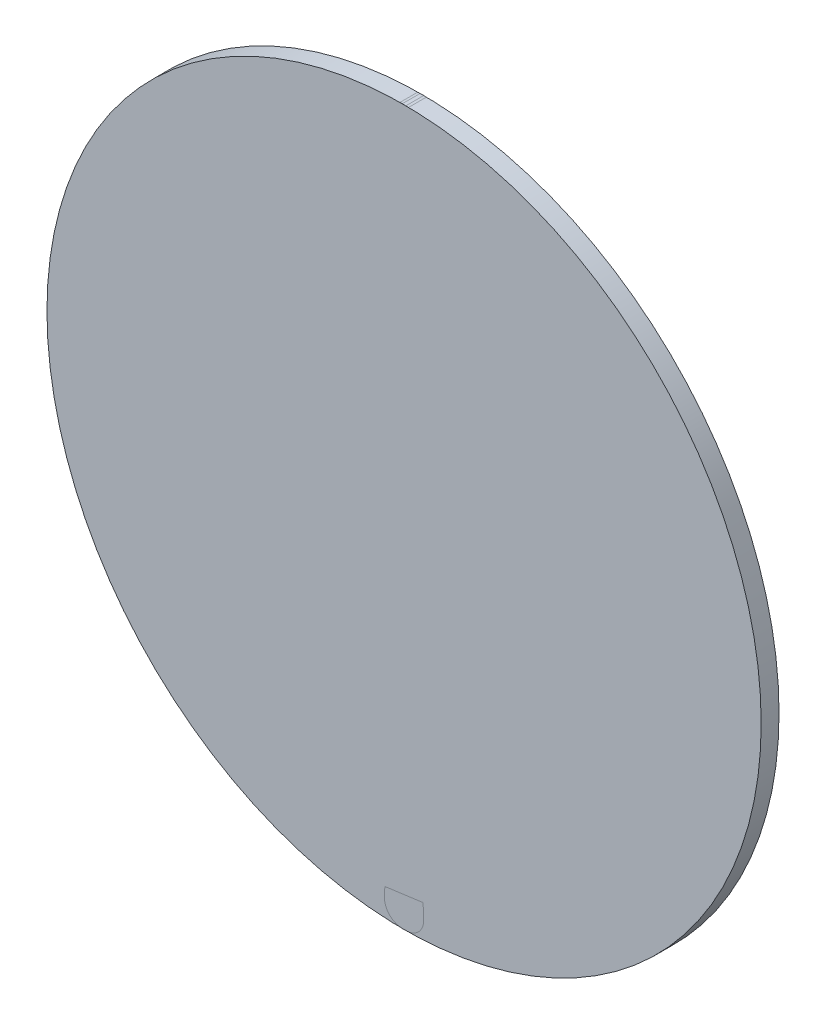
ISO-10303-21;
HEADER;
FILE_DESCRIPTION(('STEP AP214'),'2;1');
FILE_NAME('part.step','',(''),(''),'','','');
FILE_SCHEMA(('AUTOMOTIVE_DESIGN { 1 0 10303 214 1 1 1 1 }'));
ENDSEC;
DATA;
#1=APPLICATION_CONTEXT('core data for automotive mechanical design processes');
#2=APPLICATION_PROTOCOL_DEFINITION('international standard','automotive_design',2000,#1);
#3=PRODUCT_CONTEXT('',#1,'mechanical');
#4=PRODUCT('Part','Part','',(#3));
#5=PRODUCT_RELATED_PRODUCT_CATEGORY('part','',(#4));
#6=PRODUCT_DEFINITION_FORMATION('','',#4);
#7=PRODUCT_DEFINITION_CONTEXT('part definition',#1,'design');
#8=PRODUCT_DEFINITION('design','',#6,#7);
#9=PRODUCT_DEFINITION_SHAPE('','',#8);
#10=(LENGTH_UNIT() NAMED_UNIT(*) SI_UNIT(.MILLI.,.METRE.));
#11=(NAMED_UNIT(*) PLANE_ANGLE_UNIT() SI_UNIT($,.RADIAN.));
#12=(NAMED_UNIT(*) SI_UNIT($,.STERADIAN.) SOLID_ANGLE_UNIT());
#13=UNCERTAINTY_MEASURE_WITH_UNIT(LENGTH_MEASURE(1.E-05),#10,'distance_accuracy_value','');
#14=(GEOMETRIC_REPRESENTATION_CONTEXT(3) GLOBAL_UNCERTAINTY_ASSIGNED_CONTEXT((#13)) GLOBAL_UNIT_ASSIGNED_CONTEXT((#10,
#11,#12)) REPRESENTATION_CONTEXT('',''));
#15=CARTESIAN_POINT('',(0.,0.,0.));
#16=DIRECTION('',(0.,0.,1.));
#17=DIRECTION('',(1.,0.,0.));
#18=AXIS2_PLACEMENT_3D('',#15,#16,#17);
#19=CARTESIAN_POINT('',(0.641043792955212,-120.65,-3.175));
#20=DIRECTION('',(0.,0.,-1.));
#21=DIRECTION('',(-1.,0.,0.));
#22=AXIS2_PLACEMENT_3D('',#19,#20,#21);
#23=PLANE('',#22);
#24=CARTESIAN_POINT('',(0.,0.,-3.17499999999998));
#25=DIRECTION('',(0.,0.,-1.));
#26=DIRECTION('',(-1.,0.,0.));
#27=AXIS2_PLACEMENT_3D('',#24,#25,#26);
#28=CIRCLE('',#27,127.001617852469);
#29=CARTESIAN_POINT('',(127.001617852469,0.,-3.17499999999993));
#30=VERTEX_POINT('',#29);
#31=EDGE_CURVE('E11',#30,#30,#28,.F.);
#32=ORIENTED_EDGE('',*,*,#31,.F.);
#33=EDGE_LOOP('',(#32));
#34=FACE_BOUND('',#33,.T.);
#35=ADVANCED_FACE('F59',(#34),#23,.T.);
#36=CARTESIAN_POINT('',(0.,0.,3.175));
#37=DIRECTION('',(0.,0.,1.));
#38=DIRECTION('',(1.,0.,0.));
#39=AXIS2_PLACEMENT_3D('',#36,#37,#38);
#40=PLANE('',#39);
#41=CARTESIAN_POINT('',(0.,0.,3.175));
#42=DIRECTION('',(0.,0.,1.));
#43=DIRECTION('',(1.,0.,0.));
#44=AXIS2_PLACEMENT_3D('',#41,#42,#43);
#45=CIRCLE('',#44,127.001617852469);
#46=CARTESIAN_POINT('',(127.001617852469,0.,3.17500000000004));
#47=VERTEX_POINT('',#46);
#48=EDGE_CURVE('E66',#47,#47,#45,.T.);
#49=ORIENTED_EDGE('',*,*,#48,.T.);
#50=EDGE_LOOP('',(#49));
#51=FACE_BOUND('',#50,.T.);
#52=ADVANCED_FACE('F73',(#51),#40,.T.);
#53=CARTESIAN_POINT('',(0.,0.,-362.389820820572));
#54=DIRECTION('',(0.,0.,1.));
#55=DIRECTION('',(1.,0.,0.));
#56=AXIS2_PLACEMENT_3D('',#53,#54,#55);
#57=CYLINDRICAL_SURFACE('',#56,127.001617852469);
#58=CARTESIAN_POINT('',(127.001617852469,0.,3.17500000000004));
#59=CARTESIAN_POINT('',(127.001617852469,0.,3.10885416666671));
#60=CARTESIAN_POINT('',(127.001617852469,0.,3.04270833333338));
#61=CARTESIAN_POINT('',(127.001617852469,0.,2.91041666666671));
#62=CARTESIAN_POINT('',(127.001617852469,0.,2.84427083333337));
#63=CARTESIAN_POINT('',(127.001617852469,0.,2.71197916666669));
#64=CARTESIAN_POINT('',(127.001617852469,0.,2.64583333333337));
#65=CARTESIAN_POINT('',(127.001617852469,0.,2.51354166666671));
#66=CARTESIAN_POINT('',(127.001617852469,0.,2.44739583333338));
#67=CARTESIAN_POINT('',(127.001617852469,0.,2.31510416666671));
#68=CARTESIAN_POINT('',(127.001617852469,0.,2.24895833333337));
#69=CARTESIAN_POINT('',(127.001617852469,0.,2.11666666666669));
#70=CARTESIAN_POINT('',(127.001617852469,0.,2.05052083333337));
#71=CARTESIAN_POINT('',(127.001617852469,0.,1.91822916666671));
#72=CARTESIAN_POINT('',(127.001617852469,0.,1.85208333333338));
#73=CARTESIAN_POINT('',(127.001617852469,0.,1.71979166666673));
#74=CARTESIAN_POINT('',(127.001617852469,0.,1.6536458333334));
#75=CARTESIAN_POINT('',(127.001617852469,0.,1.52135416666673));
#76=CARTESIAN_POINT('',(127.001617852469,0.,1.45520833333338));
#77=CARTESIAN_POINT('',(127.001617852469,0.,1.32291666666671));
#78=CARTESIAN_POINT('',(127.001617852469,0.,1.25677083333338));
#79=CARTESIAN_POINT('',(127.001617852469,0.,1.12447916666673));
#80=CARTESIAN_POINT('',(127.001617852469,0.,1.0583333333334));
#81=CARTESIAN_POINT('',(127.001617852469,0.,0.926041666666729));
#82=CARTESIAN_POINT('',(127.001617852469,0.,0.859895833333383));
#83=CARTESIAN_POINT('',(127.001617852469,0.,0.72760416666671));
#84=CARTESIAN_POINT('',(127.001617852469,0.,0.661458333333383));
#85=CARTESIAN_POINT('',(127.001617852469,0.,0.529166666666729));
#86=CARTESIAN_POINT('',(127.001617852469,0.,0.463020833333401));
#87=CARTESIAN_POINT('',(127.001617852469,0.,0.330729166666729));
#88=CARTESIAN_POINT('',(127.001617852469,0.,0.264583333333383));
#89=CARTESIAN_POINT('',(127.001617852469,0.,0.13229166666671));
#90=CARTESIAN_POINT('',(127.001617852469,0.,0.0661458333333827));
#91=CARTESIAN_POINT('',(127.001617852469,0.,-0.0661458333332717));
#92=CARTESIAN_POINT('',(127.001617852469,0.,-0.132291666666599));
#93=CARTESIAN_POINT('',(127.001617852469,0.,-0.264583333333272));
#94=CARTESIAN_POINT('',(127.001617852469,0.,-0.330729166666618));
#95=CARTESIAN_POINT('',(127.001617852469,0.,-0.46302083333329));
#96=CARTESIAN_POINT('',(127.001617852469,0.,-0.529166666666618));
#97=CARTESIAN_POINT('',(127.001617852469,0.,-0.661458333333272));
#98=CARTESIAN_POINT('',(127.001617852469,0.,-0.727604166666599));
#99=CARTESIAN_POINT('',(127.001617852469,0.,-0.859895833333272));
#100=CARTESIAN_POINT('',(127.001617852469,0.,-0.926041666666618));
#101=CARTESIAN_POINT('',(127.001617852469,0.,-1.05833333333329));
#102=CARTESIAN_POINT('',(127.001617852469,0.,-1.12447916666662));
#103=CARTESIAN_POINT('',(127.001617852469,0.,-1.25677083333327));
#104=CARTESIAN_POINT('',(127.001617852469,0.,-1.3229166666666));
#105=CARTESIAN_POINT('',(127.001617852469,0.,-1.45520833333327));
#106=CARTESIAN_POINT('',(127.001617852469,0.,-1.52135416666662));
#107=CARTESIAN_POINT('',(127.001617852469,0.,-1.65364583333329));
#108=CARTESIAN_POINT('',(127.001617852469,0.,-1.71979166666662));
#109=CARTESIAN_POINT('',(127.001617852469,0.,-1.85208333333327));
#110=CARTESIAN_POINT('',(127.001617852469,0.,-1.9182291666666));
#111=CARTESIAN_POINT('',(127.001617852469,0.,-2.05052083333325));
#112=CARTESIAN_POINT('',(127.001617852469,0.,-2.11666666666658));
#113=CARTESIAN_POINT('',(127.001617852469,0.,-2.24895833333325));
#114=CARTESIAN_POINT('',(127.001617852469,0.,-2.3151041666666));
#115=CARTESIAN_POINT('',(127.001617852469,0.,-2.44739583333327));
#116=CARTESIAN_POINT('',(127.001617852469,0.,-2.5135416666666));
#117=CARTESIAN_POINT('',(127.001617852469,0.,-2.64583333333325));
#118=CARTESIAN_POINT('',(127.001617852469,0.,-2.71197916666658));
#119=CARTESIAN_POINT('',(127.001617852469,0.,-2.84427083333325));
#120=CARTESIAN_POINT('',(127.001617852469,0.,-2.9104166666666));
#121=CARTESIAN_POINT('',(127.001617852469,0.,-3.04270833333327));
#122=CARTESIAN_POINT('',(127.001617852469,0.,-3.1088541666666));
#123=CARTESIAN_POINT('',(127.001617852469,0.,-3.17499999999993));
#124=B_SPLINE_CURVE_WITH_KNOTS('',3,(#58,#59,#60,#61,#62,#63,#64,#65,#66,#67,#68,#69,#70,#71,
#72,#73,#74,#75,#76,#77,#78,#79,#80,#81,#82,#83,#84,#85,#86,#87,#88,#89,#90,#91,#92,#93,#94,#95,
#96,#97,#98,#99,#100,#101,#102,#103,#104,#105,#106,#107,#108,#109,#110,#111,#112,#113,#114,#115,
#116,#117,#118,#119,#120,#121,#122,#123),.UNSPECIFIED.,.F.,.F.,(4,2,2,2,2,2,2,2,2,2,2,2,2,2,2,2,
2,2,2,2,2,2,2,2,2,2,2,2,2,2,2,2,4),(0.,0.198437499999982,0.396875000000019,0.5953125,
0.793749999999982,0.992187500000019,1.190625,1.38906249999998,1.58749999999996,1.7859375,
1.98437499999998,2.18281249999996,2.38125,2.57968749999998,2.77812499999996,2.9765625,
3.17499999999998,3.37343749999997,3.571875,3.77031249999998,3.96874999999997,4.1671875,
4.36562499999998,4.56406249999997,4.7625,4.96093749999998,5.15937499999997,5.35781249999995,
5.55624999999998,5.75468749999997,5.95312499999995,6.15156249999998,6.34999999999997),.UNSPECIFIED.);
#125=EDGE_CURVE('BSEAM75',#47,#30,#124,.T.);
#126=ORIENTED_EDGE('',*,*,#48,.F.);
#127=ORIENTED_EDGE('',*,*,#31,.T.);
#128=ORIENTED_EDGE('',*,*,#125,.T.);
#129=ORIENTED_EDGE('',*,*,#125,.F.);
#130=EDGE_LOOP('',(#126,#128,#127,#129));
#131=FACE_BOUND('',#130,.T.);
#132=ADVANCED_FACE('F75',(#131),#57,.T.);
#133=CLOSED_SHELL('',(#35,#52,#132));
#134=MANIFOLD_SOLID_BREP('B2',#133);
#135=CARTESIAN_POINT('',(0.641043792955212,-120.65,3.175));
#136=DIRECTION('',(0.,0.,-1.));
#137=DIRECTION('',(-1.,0.,0.));
#138=AXIS2_PLACEMENT_3D('',#135,#136,#137);
#139=PLANE('',#138);
#140=CARTESIAN_POINT('',(0.641043792955212,-120.65,3.175));
#141=DIRECTION('',(0.,0.,1.));
#142=DIRECTION('',(-1.,0.,0.));
#143=AXIS2_PLACEMENT_3D('',#140,#141,#142);
#144=CIRCLE('',#143,6.34999999999999);
#145=CARTESIAN_POINT('',(0.641043792955213,-127.,3.175));
#146=VERTEX_POINT('',#145);
#147=CARTESIAN_POINT('',(6.98499999999999,-120.37301689023,3.175));
#148=VERTEX_POINT('',#147);
#149=EDGE_CURVE('E255',#146,#148,#144,.T.);
#150=ORIENTED_EDGE('',*,*,#149,.T.);
#151=DIRECTION('',(-0.0436193873653361,0.999048221581858,0.));
#152=VECTOR('',#151,1.);
#153=CARTESIAN_POINT('',(2.13469247223707,-9.28271043655755,3.175));
#154=LINE('',#153,#152);
#155=CARTESIAN_POINT('',(2.13469247223707,-9.28271043655755,3.175));
#156=VERTEX_POINT('',#155);
#157=EDGE_CURVE('E177',#148,#156,#154,.T.);
#158=ORIENTED_EDGE('',*,*,#157,.T.);
#159=CARTESIAN_POINT('',(0.,0.,3.175));
#160=DIRECTION('',(0.,0.,1.));
#161=DIRECTION('',(1.,0.,0.));
#162=AXIS2_PLACEMENT_3D('',#159,#160,#161);
#163=CIRCLE('',#162,9.525);
#164=CARTESIAN_POINT('',(2.13469247223707,9.28271043655755,3.175));
#165=VERTEX_POINT('',#164);
#166=EDGE_CURVE('E285',#156,#165,#163,.T.);
#167=ORIENTED_EDGE('',*,*,#166,.T.);
#168=DIRECTION('',(0.0436193873653358,0.999048221581858,0.));
#169=VECTOR('',#168,1.);
#170=CARTESIAN_POINT('',(2.13469247223707,9.28271043655755,3.175));
#171=LINE('',#170,#169);
#172=CARTESIAN_POINT('',(6.98499999999996,120.37301689023,3.175));
#173=VERTEX_POINT('',#172);
#174=EDGE_CURVE('E304',#165,#173,#171,.T.);
#175=ORIENTED_EDGE('',*,*,#174,.T.);
#176=CARTESIAN_POINT('',(0.641043792955183,120.65,3.175));
#177=DIRECTION('',(0.,0.,1.));
#178=DIRECTION('',(1.,0.,0.));
#179=AXIS2_PLACEMENT_3D('',#176,#177,#178);
#180=CIRCLE('',#179,6.34999999999999);
#181=CARTESIAN_POINT('',(0.641043792955183,127.,3.175));
#182=VERTEX_POINT('',#181);
#183=EDGE_CURVE('E301',#173,#182,#180,.T.);
#184=ORIENTED_EDGE('',*,*,#183,.T.);
#185=DIRECTION('',(-1.,0.,0.));
#186=VECTOR('',#185,1.);
#187=CARTESIAN_POINT('',(-0.641043792955213,127.,3.175));
#188=LINE('',#187,#186);
#189=CARTESIAN_POINT('',(-0.641043792955213,127.,3.175));
#190=VERTEX_POINT('',#189);
#191=EDGE_CURVE('E303',#182,#190,#188,.T.);
#192=ORIENTED_EDGE('',*,*,#191,.T.);
#193=CARTESIAN_POINT('',(-0.641043792955212,120.65,3.175));
#194=DIRECTION('',(0.,0.,1.));
#195=DIRECTION('',(-1.,0.,0.));
#196=AXIS2_PLACEMENT_3D('',#193,#194,#195);
#197=CIRCLE('',#196,6.35000000000002);
#198=CARTESIAN_POINT('',(-6.98500000000003,120.37301689023,3.175));
#199=VERTEX_POINT('',#198);
#200=EDGE_CURVE('E306',#190,#199,#197,.T.);
#201=ORIENTED_EDGE('',*,*,#200,.T.);
#202=DIRECTION('',(0.0436193873653366,-0.999048221581858,0.));
#203=VECTOR('',#202,1.);
#204=CARTESIAN_POINT('',(-2.13469247223707,9.28271043655755,3.175));
#205=LINE('',#204,#203);
#206=CARTESIAN_POINT('',(-2.13469247223707,9.28271043655755,3.175));
#207=VERTEX_POINT('',#206);
#208=EDGE_CURVE('E313',#199,#207,#205,.T.);
#209=ORIENTED_EDGE('',*,*,#208,.T.);
#210=CARTESIAN_POINT('',(0.,0.,3.175));
#211=DIRECTION('',(0.,0.,1.));
#212=DIRECTION('',(1.,0.,0.));
#213=AXIS2_PLACEMENT_3D('',#210,#211,#212);
#214=CIRCLE('',#213,9.525);
#215=CARTESIAN_POINT('',(-2.13469247223708,-9.28271043655755,3.175));
#216=VERTEX_POINT('',#215);
#217=EDGE_CURVE('E210',#207,#216,#214,.T.);
#218=ORIENTED_EDGE('',*,*,#217,.T.);
#219=DIRECTION('',(-0.0436193873653364,-0.999048221581858,0.));
#220=VECTOR('',#219,1.);
#221=CARTESIAN_POINT('',(-2.13469247223707,-9.28271043655755,3.175));
#222=LINE('',#221,#220);
#223=CARTESIAN_POINT('',(-6.98500000000002,-120.37301689023,3.175));
#224=VERTEX_POINT('',#223);
#225=EDGE_CURVE('E204',#216,#224,#222,.T.);
#226=ORIENTED_EDGE('',*,*,#225,.T.);
#227=CARTESIAN_POINT('',(-0.641043792955183,-120.65,3.175));
#228=DIRECTION('',(0.,0.,1.));
#229=DIRECTION('',(1.,0.,0.));
#230=AXIS2_PLACEMENT_3D('',#227,#228,#229);
#231=CIRCLE('',#230,6.35000000000002);
#232=CARTESIAN_POINT('',(-0.641043792955184,-127.,3.175));
#233=VERTEX_POINT('',#232);
#234=EDGE_CURVE('E208',#224,#233,#231,.T.);
#235=ORIENTED_EDGE('',*,*,#234,.T.);
#236=DIRECTION('',(1.,0.,0.));
#237=VECTOR('',#236,1.);
#238=CARTESIAN_POINT('',(-0.641043792955182,-127.,3.175));
#239=LINE('',#238,#237);
#240=EDGE_CURVE('E121',#233,#146,#239,.T.);
#241=ORIENTED_EDGE('',*,*,#240,.T.);
#242=EDGE_LOOP('',(#150,#158,#167,#175,#184,#192,#201,#209,#218,#226,#235,#241));
#243=FACE_BOUND('',#242,.T.);
#244=CARTESIAN_POINT('',(0.,0.,3.175));
#245=DIRECTION('',(0.,0.,1.));
#246=DIRECTION('',(1.,0.,0.));
#247=AXIS2_PLACEMENT_3D('',#244,#245,#246);
#248=CIRCLE('',#247,2.54);
#249=CARTESIAN_POINT('',(2.54,0.,3.175));
#250=VERTEX_POINT('',#249);
#251=EDGE_CURVE('E233',#250,#250,#248,.T.);
#252=ORIENTED_EDGE('',*,*,#251,.F.);
#253=EDGE_LOOP('',(#252));
#254=FACE_BOUND('',#253,.T.);
#255=ADVANCED_FACE('F104',(#243,#254),#139,.F.);
#256=CARTESIAN_POINT('',(0.641043792955212,-120.65,-3.175));
#257=DIRECTION('',(0.,0.,-1.));
#258=DIRECTION('',(-1.,0.,0.));
#259=AXIS2_PLACEMENT_3D('',#256,#257,#258);
#260=PLANE('',#259);
#261=CARTESIAN_POINT('',(0.641043792955212,-120.65,-3.175));
#262=DIRECTION('',(0.,0.,1.));
#263=DIRECTION('',(-1.,0.,0.));
#264=AXIS2_PLACEMENT_3D('',#261,#262,#263);
#265=CIRCLE('',#264,6.34999999999999);
#266=CARTESIAN_POINT('',(0.641043792955213,-127.,-3.175));
#267=VERTEX_POINT('',#266);
#268=CARTESIAN_POINT('',(6.98499999999999,-120.37301689023,-3.175));
#269=VERTEX_POINT('',#268);
#270=EDGE_CURVE('E229',#267,#269,#265,.T.);
#271=ORIENTED_EDGE('',*,*,#270,.F.);
#272=DIRECTION('',(1.,0.,0.));
#273=VECTOR('',#272,1.);
#274=CARTESIAN_POINT('',(-0.641043792955182,-127.,-3.175));
#275=LINE('',#274,#273);
#276=CARTESIAN_POINT('',(-0.641043792955184,-127.,-3.175));
#277=VERTEX_POINT('',#276);
#278=EDGE_CURVE('E169',#277,#267,#275,.T.);
#279=ORIENTED_EDGE('',*,*,#278,.F.);
#280=CARTESIAN_POINT('',(-0.641043792955183,-120.65,-3.175));
#281=DIRECTION('',(0.,0.,1.));
#282=DIRECTION('',(1.,0.,0.));
#283=AXIS2_PLACEMENT_3D('',#280,#281,#282);
#284=CIRCLE('',#283,6.35000000000002);
#285=CARTESIAN_POINT('',(-6.98500000000002,-120.37301689023,-3.175));
#286=VERTEX_POINT('',#285);
#287=EDGE_CURVE('E163',#286,#277,#284,.T.);
#288=ORIENTED_EDGE('',*,*,#287,.F.);
#289=DIRECTION('',(-0.0436193873653364,-0.999048221581858,0.));
#290=VECTOR('',#289,1.);
#291=CARTESIAN_POINT('',(-2.13469247223707,-9.28271043655755,-3.175));
#292=LINE('',#291,#290);
#293=CARTESIAN_POINT('',(-2.13469247223708,-9.28271043655755,-3.175));
#294=VERTEX_POINT('',#293);
#295=EDGE_CURVE('E219',#294,#286,#292,.T.);
#296=ORIENTED_EDGE('',*,*,#295,.F.);
#297=CARTESIAN_POINT('',(0.,0.,-3.175));
#298=DIRECTION('',(0.,0.,1.));
#299=DIRECTION('',(1.,0.,0.));
#300=AXIS2_PLACEMENT_3D('',#297,#298,#299);
#301=CIRCLE('',#300,9.525);
#302=CARTESIAN_POINT('',(-2.13469247223707,9.28271043655755,-3.175));
#303=VERTEX_POINT('',#302);
#304=EDGE_CURVE('E250',#303,#294,#301,.T.);
#305=ORIENTED_EDGE('',*,*,#304,.F.);
#306=DIRECTION('',(0.0436193873653366,-0.999048221581858,0.));
#307=VECTOR('',#306,1.);
#308=CARTESIAN_POINT('',(-2.13469247223707,9.28271043655755,-3.175));
#309=LINE('',#308,#307);
#310=CARTESIAN_POINT('',(-6.98500000000003,120.37301689023,-3.175));
#311=VERTEX_POINT('',#310);
#312=EDGE_CURVE('E247',#311,#303,#309,.T.);
#313=ORIENTED_EDGE('',*,*,#312,.F.);
#314=CARTESIAN_POINT('',(-0.641043792955212,120.65,-3.175));
#315=DIRECTION('',(0.,0.,1.));
#316=DIRECTION('',(-1.,0.,0.));
#317=AXIS2_PLACEMENT_3D('',#314,#315,#316);
#318=CIRCLE('',#317,6.35000000000002);
#319=CARTESIAN_POINT('',(-0.641043792955213,127.,-3.175));
#320=VERTEX_POINT('',#319);
#321=EDGE_CURVE('E244',#320,#311,#318,.T.);
#322=ORIENTED_EDGE('',*,*,#321,.F.);
#323=DIRECTION('',(-1.,0.,0.));
#324=VECTOR('',#323,1.);
#325=CARTESIAN_POINT('',(-0.641043792955213,127.,-3.175));
#326=LINE('',#325,#324);
#327=CARTESIAN_POINT('',(0.641043792955183,127.,-3.175));
#328=VERTEX_POINT('',#327);
#329=EDGE_CURVE('E242',#328,#320,#326,.T.);
#330=ORIENTED_EDGE('',*,*,#329,.F.);
#331=CARTESIAN_POINT('',(0.641043792955183,120.65,-3.175));
#332=DIRECTION('',(0.,0.,1.));
#333=DIRECTION('',(1.,0.,0.));
#334=AXIS2_PLACEMENT_3D('',#331,#332,#333);
#335=CIRCLE('',#334,6.34999999999999);
#336=CARTESIAN_POINT('',(6.98499999999996,120.37301689023,-3.175));
#337=VERTEX_POINT('',#336);
#338=EDGE_CURVE('E240',#337,#328,#335,.T.);
#339=ORIENTED_EDGE('',*,*,#338,.F.);
#340=DIRECTION('',(0.0436193873653358,0.999048221581858,0.));
#341=VECTOR('',#340,1.);
#342=CARTESIAN_POINT('',(2.13469247223707,9.28271043655755,-3.175));
#343=LINE('',#342,#341);
#344=CARTESIAN_POINT('',(2.13469247223707,9.28271043655755,-3.175));
#345=VERTEX_POINT('',#344);
#346=EDGE_CURVE('E237',#345,#337,#343,.T.);
#347=ORIENTED_EDGE('',*,*,#346,.F.);
#348=CARTESIAN_POINT('',(0.,0.,-3.175));
#349=DIRECTION('',(0.,0.,1.));
#350=DIRECTION('',(1.,0.,0.));
#351=AXIS2_PLACEMENT_3D('',#348,#349,#350);
#352=CIRCLE('',#351,9.525);
#353=CARTESIAN_POINT('',(2.13469247223707,-9.28271043655755,-3.175));
#354=VERTEX_POINT('',#353);
#355=EDGE_CURVE('E235',#354,#345,#352,.T.);
#356=ORIENTED_EDGE('',*,*,#355,.F.);
#357=DIRECTION('',(-0.0436193873653361,0.999048221581858,0.));
#358=VECTOR('',#357,1.);
#359=CARTESIAN_POINT('',(2.13469247223707,-9.28271043655755,-3.175));
#360=LINE('',#359,#358);
#361=EDGE_CURVE('E232',#269,#354,#360,.T.);
#362=ORIENTED_EDGE('',*,*,#361,.F.);
#363=EDGE_LOOP('',(#271,#279,#288,#296,#305,#313,#322,#330,#339,#347,#356,#362));
#364=FACE_BOUND('',#363,.T.);
#365=CARTESIAN_POINT('',(0.,0.,-3.175));
#366=DIRECTION('',(0.,0.,1.));
#367=DIRECTION('',(1.,0.,0.));
#368=AXIS2_PLACEMENT_3D('',#365,#366,#367);
#369=CIRCLE('',#368,2.54);
#370=CARTESIAN_POINT('',(2.54,0.,-3.175));
#371=VERTEX_POINT('',#370);
#372=EDGE_CURVE('E318',#371,#371,#369,.T.);
#373=ORIENTED_EDGE('',*,*,#372,.T.);
#374=EDGE_LOOP('',(#373));
#375=FACE_BOUND('',#374,.T.);
#376=ADVANCED_FACE('F289',(#364,#375),#260,.T.);
#377=CARTESIAN_POINT('',(0.641043792955212,-120.65,3.175));
#378=DIRECTION('',(0.,0.,-1.));
#379=DIRECTION('',(-1.,0.,0.));
#380=AXIS2_PLACEMENT_3D('',#377,#378,#379);
#381=CYLINDRICAL_SURFACE('',#380,6.34999999999999);
#382=ORIENTED_EDGE('',*,*,#270,.T.);
#383=DIRECTION('',(0.,0.,-1.));
#384=VECTOR('',#383,1.);
#385=CARTESIAN_POINT('',(6.98499999999999,-120.37301689023,3.175));
#386=LINE('',#385,#384);
#387=EDGE_CURVE('E57',#148,#269,#386,.T.);
#388=ORIENTED_EDGE('',*,*,#387,.F.);
#389=ORIENTED_EDGE('',*,*,#149,.F.);
#390=DIRECTION('',(0.,0.,-1.));
#391=VECTOR('',#390,1.);
#392=CARTESIAN_POINT('',(0.641043792955213,-127.,3.175));
#393=LINE('',#392,#391);
#394=EDGE_CURVE('E225',#146,#267,#393,.T.);
#395=ORIENTED_EDGE('',*,*,#394,.T.);
#396=EDGE_LOOP('',(#382,#388,#389,#395));
#397=FACE_BOUND('',#396,.T.);
#398=ADVANCED_FACE('F106',(#397),#381,.T.);
#399=CARTESIAN_POINT('',(2.13469247223707,-9.28271043655755,3.175));
#400=DIRECTION('',(-0.999048221581858,-0.0436193873653361,0.));
#401=DIRECTION('',(0.0436193873653361,-0.999048221581858,0.));
#402=AXIS2_PLACEMENT_3D('',#399,#400,#401);
#403=PLANE('',#402);
#404=ORIENTED_EDGE('',*,*,#361,.T.);
#405=DIRECTION('',(0.,0.,-1.));
#406=VECTOR('',#405,1.);
#407=CARTESIAN_POINT('',(2.13469247223707,-9.28271043655755,3.175));
#408=LINE('',#407,#406);
#409=EDGE_CURVE('E113',#156,#354,#408,.T.);
#410=ORIENTED_EDGE('',*,*,#409,.F.);
#411=ORIENTED_EDGE('',*,*,#157,.F.);
#412=ORIENTED_EDGE('',*,*,#387,.T.);
#413=EDGE_LOOP('',(#404,#410,#411,#412));
#414=FACE_BOUND('',#413,.T.);
#415=ADVANCED_FACE('F329',(#414),#403,.F.);
#416=CARTESIAN_POINT('',(0.,0.,3.175));
#417=DIRECTION('',(0.,0.,-1.));
#418=DIRECTION('',(-1.,0.,0.));
#419=AXIS2_PLACEMENT_3D('',#416,#417,#418);
#420=CYLINDRICAL_SURFACE('',#419,9.525);
#421=ORIENTED_EDGE('',*,*,#355,.T.);
#422=DIRECTION('',(0.,0.,-1.));
#423=VECTOR('',#422,1.);
#424=CARTESIAN_POINT('',(2.13469247223707,9.28271043655755,3.175));
#425=LINE('',#424,#423);
#426=EDGE_CURVE('E277',#165,#345,#425,.T.);
#427=ORIENTED_EDGE('',*,*,#426,.F.);
#428=ORIENTED_EDGE('',*,*,#166,.F.);
#429=ORIENTED_EDGE('',*,*,#409,.T.);
#430=EDGE_LOOP('',(#421,#427,#428,#429));
#431=FACE_BOUND('',#430,.T.);
#432=ADVANCED_FACE('F283',(#431),#420,.T.);
#433=CARTESIAN_POINT('',(2.13469247223707,9.28271043655755,3.175));
#434=DIRECTION('',(-0.999048221581858,0.0436193873653358,0.));
#435=DIRECTION('',(-0.0436193873653358,-0.999048221581858,0.));
#436=AXIS2_PLACEMENT_3D('',#433,#434,#435);
#437=PLANE('',#436);
#438=ORIENTED_EDGE('',*,*,#346,.T.);
#439=DIRECTION('',(0.,0.,-1.));
#440=VECTOR('',#439,1.);
#441=CARTESIAN_POINT('',(6.98499999999996,120.37301689023,3.175));
#442=LINE('',#441,#440);
#443=EDGE_CURVE('E274',#173,#337,#442,.T.);
#444=ORIENTED_EDGE('',*,*,#443,.F.);
#445=ORIENTED_EDGE('',*,*,#174,.F.);
#446=ORIENTED_EDGE('',*,*,#426,.T.);
#447=EDGE_LOOP('',(#438,#444,#445,#446));
#448=FACE_BOUND('',#447,.T.);
#449=ADVANCED_FACE('F295',(#448),#437,.F.);
#450=CARTESIAN_POINT('',(0.641043792955183,120.65,3.175));
#451=DIRECTION('',(0.,0.,-1.));
#452=DIRECTION('',(-1.,0.,0.));
#453=AXIS2_PLACEMENT_3D('',#450,#451,#452);
#454=CYLINDRICAL_SURFACE('',#453,6.34999999999999);
#455=ORIENTED_EDGE('',*,*,#338,.T.);
#456=DIRECTION('',(0.,0.,-1.));
#457=VECTOR('',#456,1.);
#458=CARTESIAN_POINT('',(0.641043792955183,127.,3.175));
#459=LINE('',#458,#457);
#460=EDGE_CURVE('E271',#182,#328,#459,.T.);
#461=ORIENTED_EDGE('',*,*,#460,.F.);
#462=ORIENTED_EDGE('',*,*,#183,.F.);
#463=ORIENTED_EDGE('',*,*,#443,.T.);
#464=EDGE_LOOP('',(#455,#461,#462,#463));
#465=FACE_BOUND('',#464,.T.);
#466=ADVANCED_FACE('F299',(#465),#454,.T.);
#467=CARTESIAN_POINT('',(-0.641043792955213,127.,3.175));
#468=DIRECTION('',(0.,-1.,0.));
#469=DIRECTION('',(0.,0.,-1.));
#470=AXIS2_PLACEMENT_3D('',#467,#468,#469);
#471=PLANE('',#470);
#472=ORIENTED_EDGE('',*,*,#329,.T.);
#473=DIRECTION('',(0.,0.,-1.));
#474=VECTOR('',#473,1.);
#475=CARTESIAN_POINT('',(-0.641043792955213,127.,3.175));
#476=LINE('',#475,#474);
#477=EDGE_CURVE('E268',#190,#320,#476,.T.);
#478=ORIENTED_EDGE('',*,*,#477,.F.);
#479=ORIENTED_EDGE('',*,*,#191,.F.);
#480=ORIENTED_EDGE('',*,*,#460,.T.);
#481=EDGE_LOOP('',(#472,#478,#479,#480));
#482=FACE_BOUND('',#481,.T.);
#483=ADVANCED_FACE('F364',(#482),#471,.F.);
#484=CARTESIAN_POINT('',(-0.641043792955212,120.65,3.175));
#485=DIRECTION('',(0.,0.,-1.));
#486=DIRECTION('',(-1.,0.,0.));
#487=AXIS2_PLACEMENT_3D('',#484,#485,#486);
#488=CYLINDRICAL_SURFACE('',#487,6.35000000000002);
#489=ORIENTED_EDGE('',*,*,#321,.T.);
#490=DIRECTION('',(0.,0.,-1.));
#491=VECTOR('',#490,1.);
#492=CARTESIAN_POINT('',(-6.98500000000003,120.37301689023,3.175));
#493=LINE('',#492,#491);
#494=EDGE_CURVE('E264',#199,#311,#493,.T.);
#495=ORIENTED_EDGE('',*,*,#494,.F.);
#496=ORIENTED_EDGE('',*,*,#200,.F.);
#497=ORIENTED_EDGE('',*,*,#477,.T.);
#498=EDGE_LOOP('',(#489,#495,#496,#497));
#499=FACE_BOUND('',#498,.T.);
#500=ADVANCED_FACE('F360',(#499),#488,.T.);
#501=CARTESIAN_POINT('',(-2.13469247223707,9.28271043655755,3.175));
#502=DIRECTION('',(0.999048221581858,0.0436193873653366,0.));
#503=DIRECTION('',(-0.0436193873653366,0.999048221581858,0.));
#504=AXIS2_PLACEMENT_3D('',#501,#502,#503);
#505=PLANE('',#504);
#506=ORIENTED_EDGE('',*,*,#312,.T.);
#507=DIRECTION('',(0.,0.,-1.));
#508=VECTOR('',#507,1.);
#509=CARTESIAN_POINT('',(-2.13469247223707,9.28271043655755,3.175));
#510=LINE('',#509,#508);
#511=EDGE_CURVE('E260',#207,#303,#510,.T.);
#512=ORIENTED_EDGE('',*,*,#511,.F.);
#513=ORIENTED_EDGE('',*,*,#208,.F.);
#514=ORIENTED_EDGE('',*,*,#494,.T.);
#515=EDGE_LOOP('',(#506,#512,#513,#514));
#516=FACE_BOUND('',#515,.T.);
#517=ADVANCED_FACE('F356',(#516),#505,.F.);
#518=CARTESIAN_POINT('',(0.,0.,3.175));
#519=DIRECTION('',(0.,0.,-1.));
#520=DIRECTION('',(-1.,0.,0.));
#521=AXIS2_PLACEMENT_3D('',#518,#519,#520);
#522=CYLINDRICAL_SURFACE('',#521,9.525);
#523=ORIENTED_EDGE('',*,*,#304,.T.);
#524=DIRECTION('',(0.,0.,-1.));
#525=VECTOR('',#524,1.);
#526=CARTESIAN_POINT('',(-2.13469247223708,-9.28271043655755,3.175));
#527=LINE('',#526,#525);
#528=EDGE_CURVE('E220',#216,#294,#527,.T.);
#529=ORIENTED_EDGE('',*,*,#528,.F.);
#530=ORIENTED_EDGE('',*,*,#217,.F.);
#531=ORIENTED_EDGE('',*,*,#511,.T.);
#532=EDGE_LOOP('',(#523,#529,#530,#531));
#533=FACE_BOUND('',#532,.T.);
#534=ADVANCED_FACE('F353',(#533),#522,.T.);
#535=CARTESIAN_POINT('',(-2.13469247223707,-9.28271043655755,3.175));
#536=DIRECTION('',(0.999048221581858,-0.0436193873653364,0.));
#537=DIRECTION('',(0.0436193873653364,0.999048221581858,0.));
#538=AXIS2_PLACEMENT_3D('',#535,#536,#537);
#539=PLANE('',#538);
#540=ORIENTED_EDGE('',*,*,#295,.T.);
#541=DIRECTION('',(0.,0.,-1.));
#542=VECTOR('',#541,1.);
#543=CARTESIAN_POINT('',(-6.98500000000002,-120.37301689023,3.175));
#544=LINE('',#543,#542);
#545=EDGE_CURVE('E216',#224,#286,#544,.T.);
#546=ORIENTED_EDGE('',*,*,#545,.F.);
#547=ORIENTED_EDGE('',*,*,#225,.F.);
#548=ORIENTED_EDGE('',*,*,#528,.T.);
#549=EDGE_LOOP('',(#540,#546,#547,#548));
#550=FACE_BOUND('',#549,.T.);
#551=ADVANCED_FACE('F217',(#550),#539,.F.);
#552=CARTESIAN_POINT('',(-0.641043792955183,-120.65,3.175));
#553=DIRECTION('',(0.,0.,-1.));
#554=DIRECTION('',(-1.,0.,0.));
#555=AXIS2_PLACEMENT_3D('',#552,#553,#554);
#556=CYLINDRICAL_SURFACE('',#555,6.35000000000002);
#557=ORIENTED_EDGE('',*,*,#287,.T.);
#558=DIRECTION('',(0.,0.,-1.));
#559=VECTOR('',#558,1.);
#560=CARTESIAN_POINT('',(-0.641043792955184,-127.,3.175));
#561=LINE('',#560,#559);
#562=EDGE_CURVE('E221',#233,#277,#561,.T.);
#563=ORIENTED_EDGE('',*,*,#562,.F.);
#564=ORIENTED_EDGE('',*,*,#234,.F.);
#565=ORIENTED_EDGE('',*,*,#545,.T.);
#566=EDGE_LOOP('',(#557,#563,#564,#565));
#567=FACE_BOUND('',#566,.T.);
#568=ADVANCED_FACE('F223',(#567),#556,.T.);
#569=CARTESIAN_POINT('',(-0.641043792955182,-127.,3.175));
#570=DIRECTION('',(0.,1.,0.));
#571=DIRECTION('',(0.,0.,1.));
#572=AXIS2_PLACEMENT_3D('',#569,#570,#571);
#573=PLANE('',#572);
#574=ORIENTED_EDGE('',*,*,#278,.T.);
#575=ORIENTED_EDGE('',*,*,#394,.F.);
#576=ORIENTED_EDGE('',*,*,#240,.F.);
#577=ORIENTED_EDGE('',*,*,#562,.T.);
#578=EDGE_LOOP('',(#574,#575,#576,#577));
#579=FACE_BOUND('',#578,.T.);
#580=ADVANCED_FACE('F346',(#579),#573,.F.);
#581=CARTESIAN_POINT('',(0.,0.,3.175));
#582=DIRECTION('',(0.,0.,-1.));
#583=DIRECTION('',(-1.,0.,0.));
#584=AXIS2_PLACEMENT_3D('',#581,#582,#583);
#585=CYLINDRICAL_SURFACE('',#584,2.54);
#586=ORIENTED_EDGE('',*,*,#251,.T.);
#587=EDGE_LOOP('',(#586));
#588=FACE_BOUND('',#587,.T.);
#589=ORIENTED_EDGE('',*,*,#372,.F.);
#590=EDGE_LOOP('',(#589));
#591=FACE_BOUND('',#590,.T.);
#592=ADVANCED_FACE('F344',(#588,#591),#585,.F.);
#593=CLOSED_SHELL('',(#255,#376,#398,#415,#432,#449,#466,#483,#500,#517,#534,#551,#568,#580,#592));
#594=MANIFOLD_SOLID_BREP('B6',#593);
#595=ADVANCED_BREP_SHAPE_REPRESENTATION('',(#18,#134,#594),#14);
#596=SHAPE_DEFINITION_REPRESENTATION(#9,#595);
ENDSEC;
END-ISO-10303-21;
